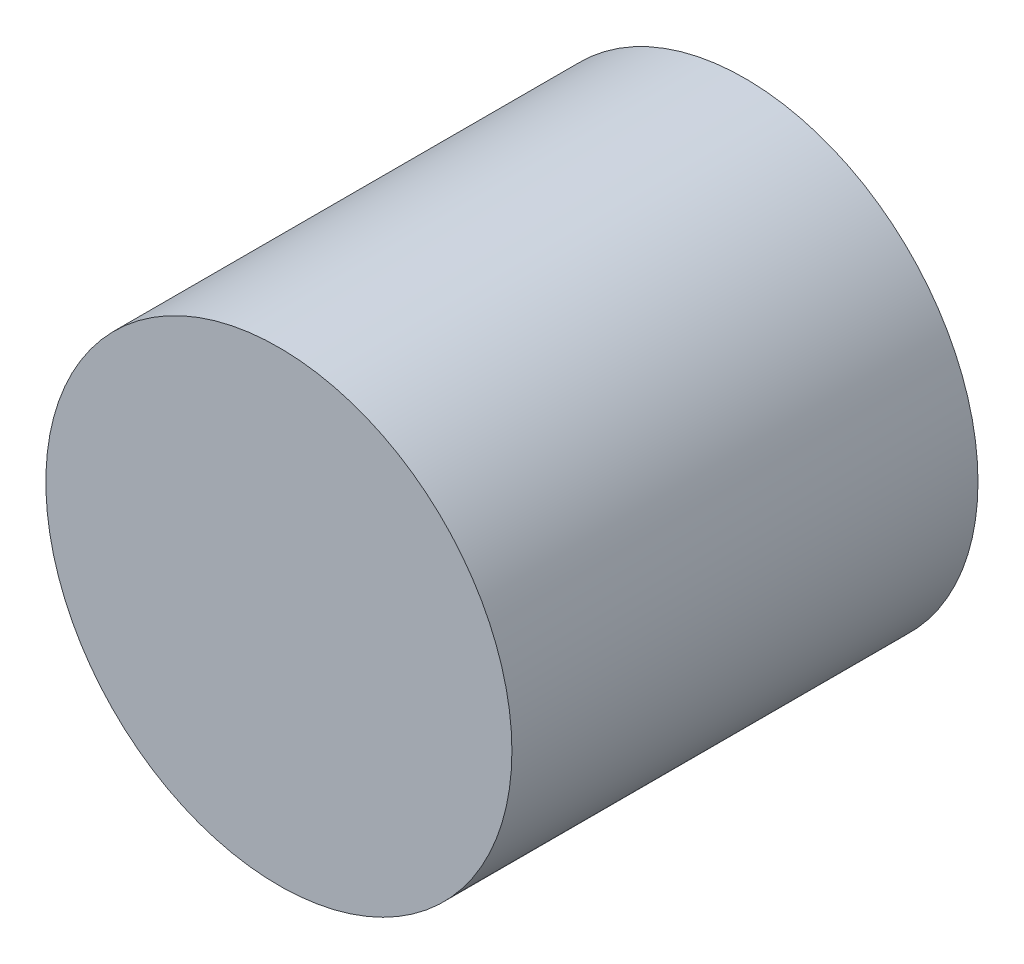
ISO-10303-21;
HEADER;
FILE_DESCRIPTION(('STEP AP214'),'2;1');
FILE_NAME('part.step','',(''),(''),'','','');
FILE_SCHEMA(('AUTOMOTIVE_DESIGN { 1 0 10303 214 1 1 1 1 }'));
ENDSEC;
DATA;
#1=APPLICATION_CONTEXT('core data for automotive mechanical design processes');
#2=APPLICATION_PROTOCOL_DEFINITION('international standard','automotive_design',2000,#1);
#3=PRODUCT_CONTEXT('',#1,'mechanical');
#4=PRODUCT('Part','Part','',(#3));
#5=PRODUCT_RELATED_PRODUCT_CATEGORY('part','',(#4));
#6=PRODUCT_DEFINITION_FORMATION('','',#4);
#7=PRODUCT_DEFINITION_CONTEXT('part definition',#1,'design');
#8=PRODUCT_DEFINITION('design','',#6,#7);
#9=PRODUCT_DEFINITION_SHAPE('','',#8);
#10=(LENGTH_UNIT() NAMED_UNIT(*) SI_UNIT(.MILLI.,.METRE.));
#11=(NAMED_UNIT(*) PLANE_ANGLE_UNIT() SI_UNIT($,.RADIAN.));
#12=(NAMED_UNIT(*) SI_UNIT($,.STERADIAN.) SOLID_ANGLE_UNIT());
#13=UNCERTAINTY_MEASURE_WITH_UNIT(LENGTH_MEASURE(1.E-05),#10,'distance_accuracy_value','');
#14=(GEOMETRIC_REPRESENTATION_CONTEXT(3) GLOBAL_UNCERTAINTY_ASSIGNED_CONTEXT((#13)) GLOBAL_UNIT_ASSIGNED_CONTEXT((#10,
#11,#12)) REPRESENTATION_CONTEXT('',''));
#15=CARTESIAN_POINT('',(0.,0.,0.));
#16=DIRECTION('',(0.,0.,1.));
#17=DIRECTION('',(1.,0.,0.));
#18=AXIS2_PLACEMENT_3D('',#15,#16,#17);
#19=CARTESIAN_POINT('',(0.,0.,70.));
#20=DIRECTION('',(0.,0.,-1.));
#21=DIRECTION('',(-1.,0.,0.));
#22=AXIS2_PLACEMENT_3D('',#19,#20,#21);
#23=CYLINDRICAL_SURFACE('',#22,35.);
#24=CARTESIAN_POINT('',(0.,0.,70.));
#25=DIRECTION('',(0.,0.,1.));
#26=DIRECTION('',(1.,0.,0.));
#27=AXIS2_PLACEMENT_3D('',#24,#25,#26);
#28=CIRCLE('',#27,35.);
#29=CARTESIAN_POINT('',(35.,0.,70.));
#30=VERTEX_POINT('',#29);
#31=EDGE_CURVE('E10',#30,#30,#28,.T.);
#32=ORIENTED_EDGE('',*,*,#31,.F.);
#33=EDGE_LOOP('',(#32));
#34=FACE_BOUND('',#33,.T.);
#35=CARTESIAN_POINT('',(0.,0.,0.));
#36=DIRECTION('',(0.,0.,1.));
#37=DIRECTION('',(1.,0.,0.));
#38=AXIS2_PLACEMENT_3D('',#35,#36,#37);
#39=CIRCLE('',#38,35.);
#40=CARTESIAN_POINT('',(35.,0.,0.));
#41=VERTEX_POINT('',#40);
#42=EDGE_CURVE('E34',#41,#41,#39,.T.);
#43=ORIENTED_EDGE('',*,*,#42,.T.);
#44=EDGE_LOOP('',(#43));
#45=FACE_BOUND('',#44,.T.);
#46=ADVANCED_FACE('F31',(#34,#45),#23,.T.);
#47=CARTESIAN_POINT('',(0.,0.,70.));
#48=DIRECTION('',(0.,0.,1.));
#49=DIRECTION('',(1.,0.,0.));
#50=AXIS2_PLACEMENT_3D('',#47,#48,#49);
#51=PLANE('',#50);
#52=ORIENTED_EDGE('',*,*,#31,.T.);
#53=EDGE_LOOP('',(#52));
#54=FACE_BOUND('',#53,.T.);
#55=ADVANCED_FACE('F46',(#54),#51,.T.);
#56=CARTESIAN_POINT('',(0.,0.,0.));
#57=DIRECTION('',(0.,0.,1.));
#58=DIRECTION('',(1.,0.,0.));
#59=AXIS2_PLACEMENT_3D('',#56,#57,#58);
#60=PLANE('',#59);
#61=ORIENTED_EDGE('',*,*,#42,.F.);
#62=EDGE_LOOP('',(#61));
#63=FACE_BOUND('',#62,.T.);
#64=ADVANCED_FACE('F44',(#63),#60,.F.);
#65=CLOSED_SHELL('',(#46,#55,#64));
#66=MANIFOLD_SOLID_BREP('B2',#65);
#67=ADVANCED_BREP_SHAPE_REPRESENTATION('',(#18,#66),#14);
#68=SHAPE_DEFINITION_REPRESENTATION(#9,#67);
ENDSEC;
END-ISO-10303-21;
